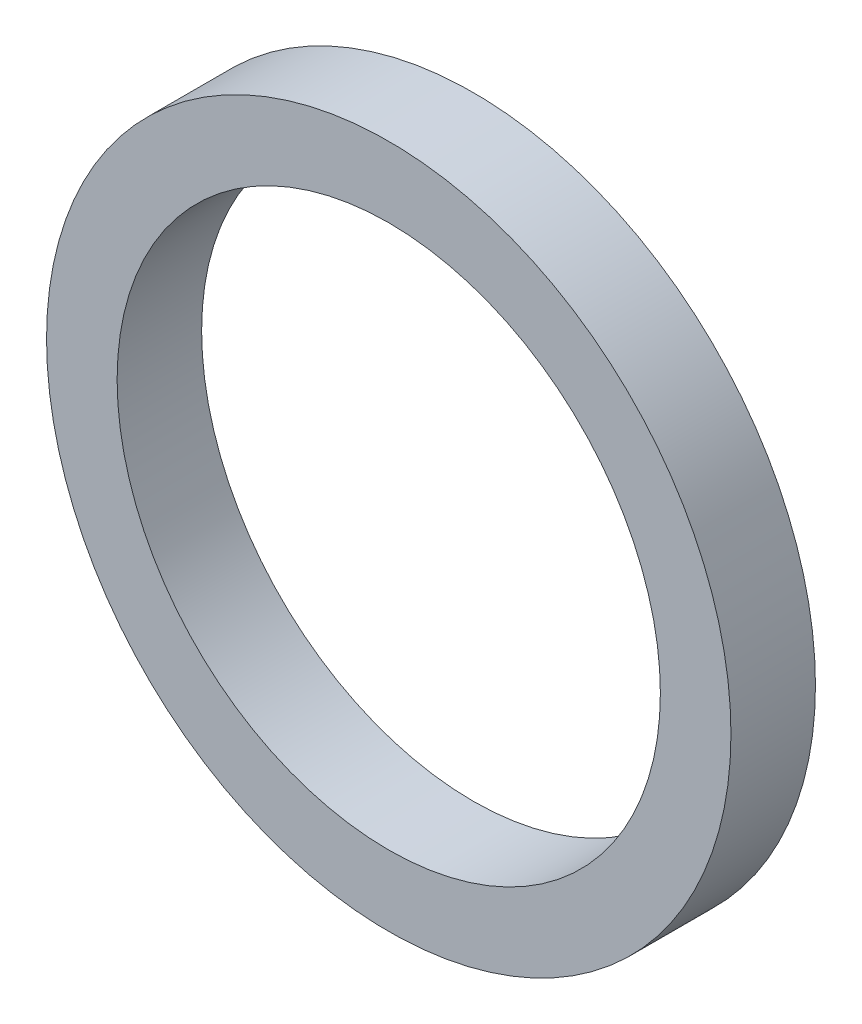
ISO-10303-21;
HEADER;
FILE_DESCRIPTION(('STEP AP214'),'2;1');
FILE_NAME('part.step','',(''),(''),'','','');
FILE_SCHEMA(('AUTOMOTIVE_DESIGN { 1 0 10303 214 1 1 1 1 }'));
ENDSEC;
DATA;
#1=APPLICATION_CONTEXT('core data for automotive mechanical design processes');
#2=APPLICATION_PROTOCOL_DEFINITION('international standard','automotive_design',2000,#1);
#3=PRODUCT_CONTEXT('',#1,'mechanical');
#4=PRODUCT('Part','Part','',(#3));
#5=PRODUCT_RELATED_PRODUCT_CATEGORY('part','',(#4));
#6=PRODUCT_DEFINITION_FORMATION('','',#4);
#7=PRODUCT_DEFINITION_CONTEXT('part definition',#1,'design');
#8=PRODUCT_DEFINITION('design','',#6,#7);
#9=PRODUCT_DEFINITION_SHAPE('','',#8);
#10=(LENGTH_UNIT() NAMED_UNIT(*) SI_UNIT(.MILLI.,.METRE.));
#11=(NAMED_UNIT(*) PLANE_ANGLE_UNIT() SI_UNIT($,.RADIAN.));
#12=(NAMED_UNIT(*) SI_UNIT($,.STERADIAN.) SOLID_ANGLE_UNIT());
#13=UNCERTAINTY_MEASURE_WITH_UNIT(LENGTH_MEASURE(1.E-05),#10,'distance_accuracy_value','');
#14=(GEOMETRIC_REPRESENTATION_CONTEXT(3) GLOBAL_UNCERTAINTY_ASSIGNED_CONTEXT((#13)) GLOBAL_UNIT_ASSIGNED_CONTEXT((#10,
#11,#12)) REPRESENTATION_CONTEXT('',''));
#15=CARTESIAN_POINT('',(0.,0.,0.));
#16=DIRECTION('',(0.,0.,1.));
#17=DIRECTION('',(1.,0.,0.));
#18=AXIS2_PLACEMENT_3D('',#15,#16,#17);
#19=CARTESIAN_POINT('',(0.,0.,8.89));
#20=DIRECTION('',(0.,0.,1.));
#21=DIRECTION('',(1.,0.,0.));
#22=AXIS2_PLACEMENT_3D('',#19,#20,#21);
#23=PLANE('',#22);
#24=CARTESIAN_POINT('',(0.,0.,8.89));
#25=DIRECTION('',(0.,0.,1.));
#26=DIRECTION('',(1.,0.,0.));
#27=AXIS2_PLACEMENT_3D('',#24,#25,#26);
#28=CIRCLE('',#27,36.);
#29=CARTESIAN_POINT('',(36.,0.,8.89));
#30=VERTEX_POINT('',#29);
#31=EDGE_CURVE('E10',#30,#30,#28,.T.);
#32=ORIENTED_EDGE('',*,*,#31,.T.);
#33=EDGE_LOOP('',(#32));
#34=FACE_BOUND('',#33,.T.);
#35=CARTESIAN_POINT('',(0.,0.,8.89));
#36=DIRECTION('',(0.,0.,1.));
#37=DIRECTION('',(1.,0.,0.));
#38=AXIS2_PLACEMENT_3D('',#35,#36,#37);
#39=CIRCLE('',#38,28.575);
#40=CARTESIAN_POINT('',(28.575,0.,8.89));
#41=VERTEX_POINT('',#40);
#42=EDGE_CURVE('E52',#41,#41,#39,.T.);
#43=ORIENTED_EDGE('',*,*,#42,.F.);
#44=EDGE_LOOP('',(#43));
#45=FACE_BOUND('',#44,.T.);
#46=ADVANCED_FACE('F38',(#34,#45),#23,.T.);
#47=CARTESIAN_POINT('',(0.,0.,0.));
#48=DIRECTION('',(0.,0.,1.));
#49=DIRECTION('',(1.,0.,0.));
#50=AXIS2_PLACEMENT_3D('',#47,#48,#49);
#51=PLANE('',#50);
#52=CARTESIAN_POINT('',(0.,0.,0.));
#53=DIRECTION('',(0.,0.,1.));
#54=DIRECTION('',(1.,0.,0.));
#55=AXIS2_PLACEMENT_3D('',#52,#53,#54);
#56=CIRCLE('',#55,36.);
#57=CARTESIAN_POINT('',(36.,0.,0.));
#58=VERTEX_POINT('',#57);
#59=EDGE_CURVE('E42',#58,#58,#56,.T.);
#60=ORIENTED_EDGE('',*,*,#59,.F.);
#61=EDGE_LOOP('',(#60));
#62=FACE_BOUND('',#61,.T.);
#63=CARTESIAN_POINT('',(0.,0.,0.));
#64=DIRECTION('',(0.,0.,1.));
#65=DIRECTION('',(1.,0.,0.));
#66=AXIS2_PLACEMENT_3D('',#63,#64,#65);
#67=CIRCLE('',#66,28.575);
#68=CARTESIAN_POINT('',(28.575,0.,0.));
#69=VERTEX_POINT('',#68);
#70=EDGE_CURVE('E54',#69,#69,#67,.T.);
#71=ORIENTED_EDGE('',*,*,#70,.T.);
#72=EDGE_LOOP('',(#71));
#73=FACE_BOUND('',#72,.T.);
#74=ADVANCED_FACE('F67',(#62,#73),#51,.F.);
#75=CARTESIAN_POINT('',(0.,0.,8.89));
#76=DIRECTION('',(0.,0.,-1.));
#77=DIRECTION('',(-1.,0.,0.));
#78=AXIS2_PLACEMENT_3D('',#75,#76,#77);
#79=CYLINDRICAL_SURFACE('',#78,36.);
#80=ORIENTED_EDGE('',*,*,#31,.F.);
#81=EDGE_LOOP('',(#80));
#82=FACE_BOUND('',#81,.T.);
#83=ORIENTED_EDGE('',*,*,#59,.T.);
#84=EDGE_LOOP('',(#83));
#85=FACE_BOUND('',#84,.T.);
#86=ADVANCED_FACE('F40',(#82,#85),#79,.T.);
#87=CARTESIAN_POINT('',(0.,0.,8.89));
#88=DIRECTION('',(0.,0.,-1.));
#89=DIRECTION('',(-1.,0.,0.));
#90=AXIS2_PLACEMENT_3D('',#87,#88,#89);
#91=CYLINDRICAL_SURFACE('',#90,28.575);
#92=ORIENTED_EDGE('',*,*,#42,.T.);
#93=EDGE_LOOP('',(#92));
#94=FACE_BOUND('',#93,.T.);
#95=ORIENTED_EDGE('',*,*,#70,.F.);
#96=EDGE_LOOP('',(#95));
#97=FACE_BOUND('',#96,.T.);
#98=ADVANCED_FACE('F63',(#94,#97),#91,.F.);
#99=CLOSED_SHELL('',(#46,#74,#86,#98));
#100=MANIFOLD_SOLID_BREP('B2',#99);
#101=ADVANCED_BREP_SHAPE_REPRESENTATION('',(#18,#100),#14);
#102=SHAPE_DEFINITION_REPRESENTATION(#9,#101);
ENDSEC;
END-ISO-10303-21;
